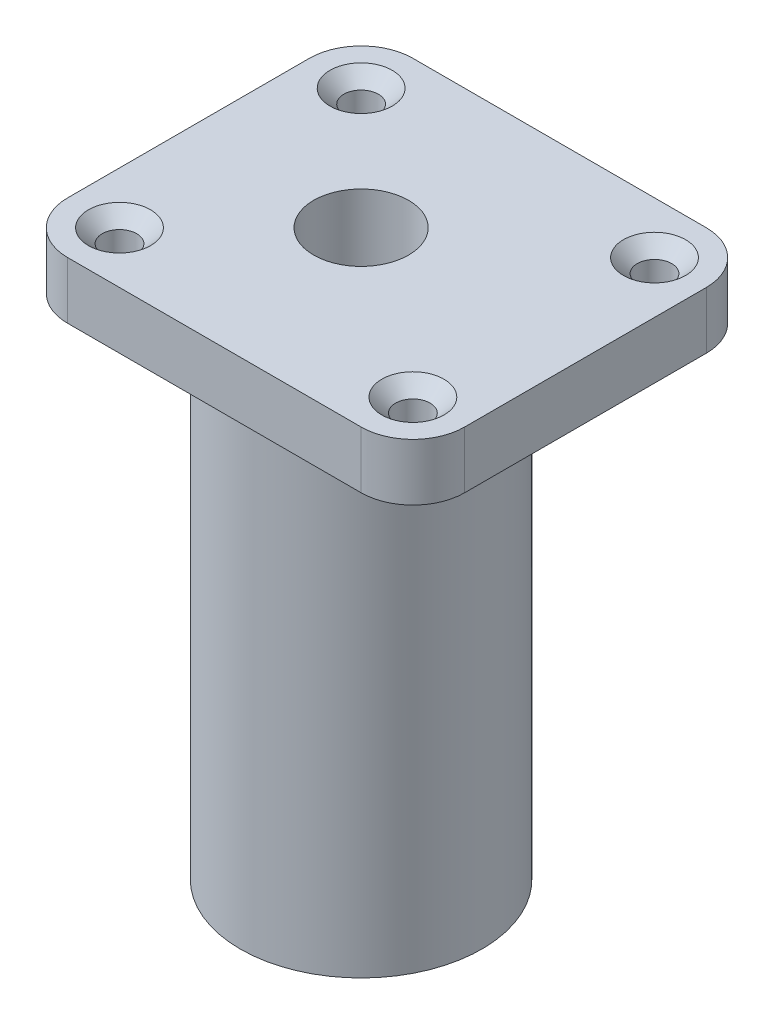
ISO-10303-21;
HEADER;
FILE_DESCRIPTION(('STEP AP214'),'2;1');
FILE_NAME('part.step','',(''),(''),'','','');
FILE_SCHEMA(('AUTOMOTIVE_DESIGN { 1 0 10303 214 1 1 1 1 }'));
ENDSEC;
DATA;
#1=APPLICATION_CONTEXT('core data for automotive mechanical design processes');
#2=APPLICATION_PROTOCOL_DEFINITION('international standard','automotive_design',2000,#1);
#3=PRODUCT_CONTEXT('',#1,'mechanical');
#4=PRODUCT('Part','Part','',(#3));
#5=PRODUCT_RELATED_PRODUCT_CATEGORY('part','',(#4));
#6=PRODUCT_DEFINITION_FORMATION('','',#4);
#7=PRODUCT_DEFINITION_CONTEXT('part definition',#1,'design');
#8=PRODUCT_DEFINITION('design','',#6,#7);
#9=PRODUCT_DEFINITION_SHAPE('','',#8);
#10=(LENGTH_UNIT() NAMED_UNIT(*) SI_UNIT(.MILLI.,.METRE.));
#11=(NAMED_UNIT(*) PLANE_ANGLE_UNIT() SI_UNIT($,.RADIAN.));
#12=(NAMED_UNIT(*) SI_UNIT($,.STERADIAN.) SOLID_ANGLE_UNIT());
#13=UNCERTAINTY_MEASURE_WITH_UNIT(LENGTH_MEASURE(1.E-05),#10,'distance_accuracy_value','');
#14=(GEOMETRIC_REPRESENTATION_CONTEXT(3) GLOBAL_UNCERTAINTY_ASSIGNED_CONTEXT((#13)) GLOBAL_UNIT_ASSIGNED_CONTEXT((#10,
#11,#12)) REPRESENTATION_CONTEXT('',''));
#15=CARTESIAN_POINT('',(0.,0.,0.));
#16=DIRECTION('',(0.,0.,1.));
#17=DIRECTION('',(1.,0.,0.));
#18=AXIS2_PLACEMENT_3D('',#15,#16,#17);
#19=CARTESIAN_POINT('',(0.,32.7,0.));
#20=DIRECTION('',(0.,-1.,0.));
#21=DIRECTION('',(0.,0.,-1.));
#22=AXIS2_PLACEMENT_3D('',#19,#20,#21);
#23=CYLINDRICAL_SURFACE('',#22,7.);
#24=CARTESIAN_POINT('',(0.,28.4,0.));
#25=DIRECTION('',(0.,1.,0.));
#26=DIRECTION('',(0.,0.,1.));
#27=AXIS2_PLACEMENT_3D('',#24,#25,#26);
#28=CIRCLE('',#27,7.);
#29=CARTESIAN_POINT('',(0.,28.4,7.));
#30=VERTEX_POINT('',#29);
#31=EDGE_CURVE('E200',#30,#30,#28,.F.);
#32=ORIENTED_EDGE('',*,*,#31,.T.);
#33=EDGE_LOOP('',(#32));
#34=FACE_BOUND('',#33,.T.);
#35=CARTESIAN_POINT('',(0.,0.,0.));
#36=DIRECTION('',(0.,1.,0.));
#37=DIRECTION('',(0.,0.,1.));
#38=AXIS2_PLACEMENT_3D('',#35,#36,#37);
#39=CIRCLE('',#38,7.);
#40=CARTESIAN_POINT('',(0.,0.,7.));
#41=VERTEX_POINT('',#40);
#42=EDGE_CURVE('E143',#41,#41,#39,.T.);
#43=ORIENTED_EDGE('',*,*,#42,.T.);
#44=EDGE_LOOP('',(#43));
#45=FACE_BOUND('',#44,.T.);
#46=ADVANCED_FACE('F45',(#34,#45),#23,.T.);
#47=CARTESIAN_POINT('',(0.,0.,0.));
#48=DIRECTION('',(0.,1.,0.));
#49=DIRECTION('',(0.,0.,1.));
#50=AXIS2_PLACEMENT_3D('',#47,#48,#49);
#51=PLANE('',#50);
#52=CARTESIAN_POINT('',(0.,0.,0.));
#53=DIRECTION('',(0.,-1.,0.));
#54=DIRECTION('',(0.,0.,-1.));
#55=AXIS2_PLACEMENT_3D('',#52,#53,#54);
#56=CIRCLE('',#55,4.6);
#57=CARTESIAN_POINT('',(0.,0.,-4.6));
#58=VERTEX_POINT('',#57);
#59=EDGE_CURVE('E195',#58,#58,#56,.T.);
#60=ORIENTED_EDGE('',*,*,#59,.F.);
#61=EDGE_LOOP('',(#60));
#62=FACE_BOUND('',#61,.T.);
#63=ORIENTED_EDGE('',*,*,#42,.F.);
#64=EDGE_LOOP('',(#63));
#65=FACE_BOUND('',#64,.T.);
#66=ADVANCED_FACE('F249',(#62,#65),#51,.F.);
#67=CARTESIAN_POINT('',(-10.,29.4,-10.));
#68=DIRECTION('',(-1.,0.,0.));
#69=DIRECTION('',(0.,0.,1.));
#70=AXIS2_PLACEMENT_3D('',#67,#68,#69);
#71=PLANE('',#70);
#72=DIRECTION('',(0.,0.,1.));
#73=VECTOR('',#72,1.);
#74=CARTESIAN_POINT('',(-10.,29.4,-10.));
#75=LINE('',#74,#73);
#76=CARTESIAN_POINT('',(-10.,29.4,-7.));
#77=VERTEX_POINT('',#76);
#78=CARTESIAN_POINT('',(-10.,29.4,7.));
#79=VERTEX_POINT('',#78);
#80=EDGE_CURVE('E316',#77,#79,#75,.T.);
#81=ORIENTED_EDGE('',*,*,#80,.T.);
#82=DIRECTION('',(0.,1.,0.));
#83=VECTOR('',#82,1.);
#84=CARTESIAN_POINT('',(-10.,29.4,7.));
#85=LINE('',#84,#83);
#86=CARTESIAN_POINT('',(-10.,32.7,7.));
#87=VERTEX_POINT('',#86);
#88=EDGE_CURVE('E126',#79,#87,#85,.T.);
#89=ORIENTED_EDGE('',*,*,#88,.T.);
#90=DIRECTION('',(0.,0.,1.));
#91=VECTOR('',#90,1.);
#92=CARTESIAN_POINT('',(-10.,32.7,-10.));
#93=LINE('',#92,#91);
#94=CARTESIAN_POINT('',(-10.,32.7,-7.));
#95=VERTEX_POINT('',#94);
#96=EDGE_CURVE('E117',#95,#87,#93,.T.);
#97=ORIENTED_EDGE('',*,*,#96,.F.);
#98=DIRECTION('',(0.,1.,0.));
#99=VECTOR('',#98,1.);
#100=CARTESIAN_POINT('',(-10.,29.4,-7.));
#101=LINE('',#100,#99);
#102=EDGE_CURVE('E132',#95,#77,#101,.F.);
#103=ORIENTED_EDGE('',*,*,#102,.T.);
#104=EDGE_LOOP('',(#81,#89,#97,#103));
#105=FACE_BOUND('',#104,.T.);
#106=ADVANCED_FACE('F131',(#105),#71,.T.);
#107=CARTESIAN_POINT('',(-10.,29.4,-10.));
#108=DIRECTION('',(0.,0.,-1.));
#109=DIRECTION('',(-1.,0.,0.));
#110=AXIS2_PLACEMENT_3D('',#107,#108,#109);
#111=PLANE('',#110);
#112=DIRECTION('',(-1.,0.,0.));
#113=VECTOR('',#112,1.);
#114=CARTESIAN_POINT('',(-10.,32.7,-10.));
#115=LINE('',#114,#113);
#116=CARTESIAN_POINT('',(10.,32.7,-10.));
#117=VERTEX_POINT('',#116);
#118=CARTESIAN_POINT('',(-7.,32.7,-10.));
#119=VERTEX_POINT('',#118);
#120=EDGE_CURVE('E119',#117,#119,#115,.T.);
#121=ORIENTED_EDGE('',*,*,#120,.F.);
#122=DIRECTION('',(0.,1.,0.));
#123=VECTOR('',#122,1.);
#124=CARTESIAN_POINT('',(10.,29.4,-10.));
#125=LINE('',#124,#123);
#126=CARTESIAN_POINT('',(10.,29.4,-10.));
#127=VERTEX_POINT('',#126);
#128=EDGE_CURVE('E187',#117,#127,#125,.F.);
#129=ORIENTED_EDGE('',*,*,#128,.T.);
#130=DIRECTION('',(-1.,0.,0.));
#131=VECTOR('',#130,1.);
#132=CARTESIAN_POINT('',(-10.,29.4,-10.));
#133=LINE('',#132,#131);
#134=CARTESIAN_POINT('',(-7.,29.4,-10.));
#135=VERTEX_POINT('',#134);
#136=EDGE_CURVE('E149',#127,#135,#133,.T.);
#137=ORIENTED_EDGE('',*,*,#136,.T.);
#138=DIRECTION('',(0.,1.,0.));
#139=VECTOR('',#138,1.);
#140=CARTESIAN_POINT('',(-7.,29.4,-10.));
#141=LINE('',#140,#139);
#142=EDGE_CURVE('E184',#135,#119,#141,.T.);
#143=ORIENTED_EDGE('',*,*,#142,.T.);
#144=EDGE_LOOP('',(#121,#129,#137,#143));
#145=FACE_BOUND('',#144,.T.);
#146=ADVANCED_FACE('F348',(#145),#111,.T.);
#147=CARTESIAN_POINT('',(13.,29.4,-10.));
#148=DIRECTION('',(1.,0.,0.));
#149=DIRECTION('',(0.,0.,-1.));
#150=AXIS2_PLACEMENT_3D('',#147,#148,#149);
#151=PLANE('',#150);
#152=DIRECTION('',(0.,0.,-1.));
#153=VECTOR('',#152,1.);
#154=CARTESIAN_POINT('',(13.,32.7,-10.));
#155=LINE('',#154,#153);
#156=CARTESIAN_POINT('',(13.,32.7,7.));
#157=VERTEX_POINT('',#156);
#158=CARTESIAN_POINT('',(13.,32.7,-7.));
#159=VERTEX_POINT('',#158);
#160=EDGE_CURVE('E332',#157,#159,#155,.T.);
#161=ORIENTED_EDGE('',*,*,#160,.F.);
#162=DIRECTION('',(0.,1.,0.));
#163=VECTOR('',#162,1.);
#164=CARTESIAN_POINT('',(13.,29.4,7.));
#165=LINE('',#164,#163);
#166=CARTESIAN_POINT('',(13.,29.4,7.));
#167=VERTEX_POINT('',#166);
#168=EDGE_CURVE('E69',#157,#167,#165,.F.);
#169=ORIENTED_EDGE('',*,*,#168,.T.);
#170=DIRECTION('',(0.,0.,-1.));
#171=VECTOR('',#170,1.);
#172=CARTESIAN_POINT('',(13.,29.4,-10.));
#173=LINE('',#172,#171);
#174=CARTESIAN_POINT('',(13.,29.4,-7.));
#175=VERTEX_POINT('',#174);
#176=EDGE_CURVE('E323',#167,#175,#173,.T.);
#177=ORIENTED_EDGE('',*,*,#176,.T.);
#178=DIRECTION('',(0.,1.,0.));
#179=VECTOR('',#178,1.);
#180=CARTESIAN_POINT('',(13.,29.4,-7.));
#181=LINE('',#180,#179);
#182=EDGE_CURVE('E178',#175,#159,#181,.T.);
#183=ORIENTED_EDGE('',*,*,#182,.T.);
#184=EDGE_LOOP('',(#161,#169,#177,#183));
#185=FACE_BOUND('',#184,.T.);
#186=ADVANCED_FACE('F336',(#185),#151,.T.);
#187=CARTESIAN_POINT('',(-10.,29.4,10.));
#188=DIRECTION('',(0.,0.,1.));
#189=DIRECTION('',(1.,0.,0.));
#190=AXIS2_PLACEMENT_3D('',#187,#188,#189);
#191=PLANE('',#190);
#192=DIRECTION('',(1.,0.,0.));
#193=VECTOR('',#192,1.);
#194=CARTESIAN_POINT('',(-10.,32.7,10.));
#195=LINE('',#194,#193);
#196=CARTESIAN_POINT('',(-7.,32.7,10.));
#197=VERTEX_POINT('',#196);
#198=CARTESIAN_POINT('',(10.,32.7,10.));
#199=VERTEX_POINT('',#198);
#200=EDGE_CURVE('E136',#197,#199,#195,.T.);
#201=ORIENTED_EDGE('',*,*,#200,.F.);
#202=DIRECTION('',(0.,1.,0.));
#203=VECTOR('',#202,1.);
#204=CARTESIAN_POINT('',(-7.,29.4,10.));
#205=LINE('',#204,#203);
#206=CARTESIAN_POINT('',(-7.,29.4,10.));
#207=VERTEX_POINT('',#206);
#208=EDGE_CURVE('E165',#197,#207,#205,.F.);
#209=ORIENTED_EDGE('',*,*,#208,.T.);
#210=DIRECTION('',(1.,0.,0.));
#211=VECTOR('',#210,1.);
#212=CARTESIAN_POINT('',(-10.,29.4,10.));
#213=LINE('',#212,#211);
#214=CARTESIAN_POINT('',(10.,29.4,10.));
#215=VERTEX_POINT('',#214);
#216=EDGE_CURVE('E319',#207,#215,#213,.T.);
#217=ORIENTED_EDGE('',*,*,#216,.T.);
#218=DIRECTION('',(0.,1.,0.));
#219=VECTOR('',#218,1.);
#220=CARTESIAN_POINT('',(10.,29.4,10.));
#221=LINE('',#220,#219);
#222=EDGE_CURVE('E161',#215,#199,#221,.T.);
#223=ORIENTED_EDGE('',*,*,#222,.T.);
#224=EDGE_LOOP('',(#201,#209,#217,#223));
#225=FACE_BOUND('',#224,.T.);
#226=ADVANCED_FACE('F345',(#225),#191,.T.);
#227=CARTESIAN_POINT('',(0.,29.4,0.));
#228=DIRECTION('',(0.,1.,0.));
#229=DIRECTION('',(0.,0.,1.));
#230=AXIS2_PLACEMENT_3D('',#227,#228,#229);
#231=PLANE('',#230);
#232=CARTESIAN_POINT('',(0.,29.4,0.));
#233=DIRECTION('',(0.,1.,0.));
#234=DIRECTION('',(0.,0.,1.));
#235=AXIS2_PLACEMENT_3D('',#232,#233,#234);
#236=CIRCLE('',#235,8.);
#237=CARTESIAN_POINT('',(0.,29.4,8.));
#238=VERTEX_POINT('',#237);
#239=EDGE_CURVE('E190',#238,#238,#236,.T.);
#240=ORIENTED_EDGE('',*,*,#239,.T.);
#241=EDGE_LOOP('',(#240));
#242=FACE_BOUND('',#241,.T.);
#243=CARTESIAN_POINT('',(-7.,29.4,7.));
#244=DIRECTION('',(0.,1.,0.));
#245=DIRECTION('',(0.,0.,1.));
#246=AXIS2_PLACEMENT_3D('',#243,#244,#245);
#247=CIRCLE('',#246,1.);
#248=CARTESIAN_POINT('',(-7.,29.4,8.));
#249=VERTEX_POINT('',#248);
#250=EDGE_CURVE('E137',#249,#249,#247,.T.);
#251=ORIENTED_EDGE('',*,*,#250,.T.);
#252=EDGE_LOOP('',(#251));
#253=FACE_BOUND('',#252,.T.);
#254=CARTESIAN_POINT('',(10.,29.4,7.));
#255=DIRECTION('',(0.,1.,0.));
#256=DIRECTION('',(0.,0.,1.));
#257=AXIS2_PLACEMENT_3D('',#254,#255,#256);
#258=CIRCLE('',#257,1.);
#259=CARTESIAN_POINT('',(10.,29.4,8.));
#260=VERTEX_POINT('',#259);
#261=EDGE_CURVE('E308',#260,#260,#258,.T.);
#262=ORIENTED_EDGE('',*,*,#261,.T.);
#263=EDGE_LOOP('',(#262));
#264=FACE_BOUND('',#263,.T.);
#265=CARTESIAN_POINT('',(10.,29.4,-7.));
#266=DIRECTION('',(0.,1.,0.));
#267=DIRECTION('',(0.,0.,1.));
#268=AXIS2_PLACEMENT_3D('',#265,#266,#267);
#269=CIRCLE('',#268,1.);
#270=CARTESIAN_POINT('',(10.,29.4,-6.));
#271=VERTEX_POINT('',#270);
#272=EDGE_CURVE('E312',#271,#271,#269,.T.);
#273=ORIENTED_EDGE('',*,*,#272,.T.);
#274=EDGE_LOOP('',(#273));
#275=FACE_BOUND('',#274,.T.);
#276=CARTESIAN_POINT('',(-7.,29.4,-7.));
#277=DIRECTION('',(0.,1.,0.));
#278=DIRECTION('',(0.,0.,1.));
#279=AXIS2_PLACEMENT_3D('',#276,#277,#278);
#280=CIRCLE('',#279,1.);
#281=CARTESIAN_POINT('',(-7.,29.4,-6.));
#282=VERTEX_POINT('',#281);
#283=EDGE_CURVE('E390',#282,#282,#280,.T.);
#284=ORIENTED_EDGE('',*,*,#283,.T.);
#285=EDGE_LOOP('',(#284));
#286=FACE_BOUND('',#285,.T.);
#287=ORIENTED_EDGE('',*,*,#216,.F.);
#288=CARTESIAN_POINT('',(-7.,29.4,7.));
#289=DIRECTION('',(0.,1.,0.));
#290=DIRECTION('',(0.,0.,1.));
#291=AXIS2_PLACEMENT_3D('',#288,#289,#290);
#292=CIRCLE('',#291,3.);
#293=EDGE_CURVE('E175',#207,#79,#292,.F.);
#294=ORIENTED_EDGE('',*,*,#293,.T.);
#295=ORIENTED_EDGE('',*,*,#80,.F.);
#296=CARTESIAN_POINT('',(-7.,29.4,-7.));
#297=DIRECTION('',(0.,1.,0.));
#298=DIRECTION('',(0.,0.,1.));
#299=AXIS2_PLACEMENT_3D('',#296,#297,#298);
#300=CIRCLE('',#299,3.);
#301=EDGE_CURVE('E141',#77,#135,#300,.F.);
#302=ORIENTED_EDGE('',*,*,#301,.T.);
#303=ORIENTED_EDGE('',*,*,#136,.F.);
#304=CARTESIAN_POINT('',(10.,29.4,-7.));
#305=DIRECTION('',(0.,1.,0.));
#306=DIRECTION('',(0.,0.,1.));
#307=AXIS2_PLACEMENT_3D('',#304,#305,#306);
#308=CIRCLE('',#307,3.);
#309=EDGE_CURVE('E62',#127,#175,#308,.F.);
#310=ORIENTED_EDGE('',*,*,#309,.T.);
#311=ORIENTED_EDGE('',*,*,#176,.F.);
#312=CARTESIAN_POINT('',(10.,29.4,7.));
#313=DIRECTION('',(0.,1.,0.));
#314=DIRECTION('',(0.,0.,1.));
#315=AXIS2_PLACEMENT_3D('',#312,#313,#314);
#316=CIRCLE('',#315,3.);
#317=EDGE_CURVE('E172',#167,#215,#316,.F.);
#318=ORIENTED_EDGE('',*,*,#317,.T.);
#319=EDGE_LOOP('',(#287,#294,#295,#302,#303,#310,#311,#318));
#320=FACE_BOUND('',#319,.T.);
#321=ADVANCED_FACE('F341',(#242,#253,#264,#275,#286,#320),#231,.F.);
#322=CARTESIAN_POINT('',(0.,32.7,0.));
#323=DIRECTION('',(0.,1.,0.));
#324=DIRECTION('',(0.,0.,1.));
#325=AXIS2_PLACEMENT_3D('',#322,#323,#324);
#326=PLANE('',#325);
#327=CARTESIAN_POINT('',(-7.,32.7,7.));
#328=DIRECTION('',(0.,1.,0.));
#329=DIRECTION('',(0.,0.,1.));
#330=AXIS2_PLACEMENT_3D('',#327,#328,#329);
#331=CIRCLE('',#330,1.80000000000001);
#332=CARTESIAN_POINT('',(-7.,32.7,8.80000000000001));
#333=VERTEX_POINT('',#332);
#334=EDGE_CURVE('E220',#333,#333,#331,.F.);
#335=ORIENTED_EDGE('',*,*,#334,.T.);
#336=EDGE_LOOP('',(#335));
#337=FACE_BOUND('',#336,.T.);
#338=CARTESIAN_POINT('',(10.,32.7,7.));
#339=DIRECTION('',(0.,1.,0.));
#340=DIRECTION('',(0.,0.,1.));
#341=AXIS2_PLACEMENT_3D('',#338,#339,#340);
#342=CIRCLE('',#341,1.80000000000001);
#343=CARTESIAN_POINT('',(10.,32.7,8.80000000000001));
#344=VERTEX_POINT('',#343);
#345=EDGE_CURVE('E216',#344,#344,#342,.F.);
#346=ORIENTED_EDGE('',*,*,#345,.T.);
#347=EDGE_LOOP('',(#346));
#348=FACE_BOUND('',#347,.T.);
#349=CARTESIAN_POINT('',(10.,32.7,-7.));
#350=DIRECTION('',(0.,1.,0.));
#351=DIRECTION('',(0.,0.,1.));
#352=AXIS2_PLACEMENT_3D('',#349,#350,#351);
#353=CIRCLE('',#352,1.80000000000001);
#354=CARTESIAN_POINT('',(10.,32.7,-5.19999999999999));
#355=VERTEX_POINT('',#354);
#356=EDGE_CURVE('E212',#355,#355,#353,.F.);
#357=ORIENTED_EDGE('',*,*,#356,.T.);
#358=EDGE_LOOP('',(#357));
#359=FACE_BOUND('',#358,.T.);
#360=CARTESIAN_POINT('',(-7.,32.7,-7.));
#361=DIRECTION('',(0.,1.,0.));
#362=DIRECTION('',(0.,0.,1.));
#363=AXIS2_PLACEMENT_3D('',#360,#361,#362);
#364=CIRCLE('',#363,1.80000000000001);
#365=CARTESIAN_POINT('',(-7.,32.7,-5.19999999999999));
#366=VERTEX_POINT('',#365);
#367=EDGE_CURVE('E208',#366,#366,#364,.F.);
#368=ORIENTED_EDGE('',*,*,#367,.T.);
#369=EDGE_LOOP('',(#368));
#370=FACE_BOUND('',#369,.T.);
#371=CARTESIAN_POINT('',(0.,32.7,0.));
#372=DIRECTION('',(0.,1.,0.));
#373=DIRECTION('',(0.,0.,1.));
#374=AXIS2_PLACEMENT_3D('',#371,#372,#373);
#375=CIRCLE('',#374,2.75);
#376=CARTESIAN_POINT('',(0.,32.7,2.75));
#377=VERTEX_POINT('',#376);
#378=EDGE_CURVE('E191',#377,#377,#375,.T.);
#379=ORIENTED_EDGE('',*,*,#378,.F.);
#380=EDGE_LOOP('',(#379));
#381=FACE_BOUND('',#380,.T.);
#382=ORIENTED_EDGE('',*,*,#96,.T.);
#383=CARTESIAN_POINT('',(-7.,32.7,7.));
#384=DIRECTION('',(0.,1.,0.));
#385=DIRECTION('',(0.,0.,1.));
#386=AXIS2_PLACEMENT_3D('',#383,#384,#385);
#387=CIRCLE('',#386,3.);
#388=EDGE_CURVE('E158',#87,#197,#387,.T.);
#389=ORIENTED_EDGE('',*,*,#388,.T.);
#390=ORIENTED_EDGE('',*,*,#200,.T.);
#391=CARTESIAN_POINT('',(10.,32.7,7.));
#392=DIRECTION('',(0.,1.,0.));
#393=DIRECTION('',(0.,0.,1.));
#394=AXIS2_PLACEMENT_3D('',#391,#392,#393);
#395=CIRCLE('',#394,3.);
#396=EDGE_CURVE('E155',#199,#157,#395,.T.);
#397=ORIENTED_EDGE('',*,*,#396,.T.);
#398=ORIENTED_EDGE('',*,*,#160,.T.);
#399=CARTESIAN_POINT('',(10.,32.7,-7.));
#400=DIRECTION('',(0.,1.,0.));
#401=DIRECTION('',(0.,0.,1.));
#402=AXIS2_PLACEMENT_3D('',#399,#400,#401);
#403=CIRCLE('',#402,3.);
#404=EDGE_CURVE('E125',#159,#117,#403,.T.);
#405=ORIENTED_EDGE('',*,*,#404,.T.);
#406=ORIENTED_EDGE('',*,*,#120,.T.);
#407=CARTESIAN_POINT('',(-7.,32.7,-7.));
#408=DIRECTION('',(0.,1.,0.));
#409=DIRECTION('',(0.,0.,1.));
#410=AXIS2_PLACEMENT_3D('',#407,#408,#409);
#411=CIRCLE('',#410,3.);
#412=EDGE_CURVE('E114',#119,#95,#411,.T.);
#413=ORIENTED_EDGE('',*,*,#412,.T.);
#414=EDGE_LOOP('',(#382,#389,#390,#397,#398,#405,#406,#413));
#415=FACE_BOUND('',#414,.T.);
#416=ADVANCED_FACE('F116',(#337,#348,#359,#370,#381,#415),#326,.T.);
#417=CARTESIAN_POINT('',(-7.,29.4,7.));
#418=DIRECTION('',(0.,1.,0.));
#419=DIRECTION('',(0.,0.,1.));
#420=AXIS2_PLACEMENT_3D('',#417,#418,#419);
#421=CYLINDRICAL_SURFACE('',#420,3.);
#422=ORIENTED_EDGE('',*,*,#293,.F.);
#423=ORIENTED_EDGE('',*,*,#208,.F.);
#424=ORIENTED_EDGE('',*,*,#388,.F.);
#425=ORIENTED_EDGE('',*,*,#88,.F.);
#426=EDGE_LOOP('',(#422,#423,#424,#425));
#427=FACE_BOUND('',#426,.T.);
#428=ADVANCED_FACE('F260',(#427),#421,.T.);
#429=CARTESIAN_POINT('',(10.,29.4,7.));
#430=DIRECTION('',(0.,1.,0.));
#431=DIRECTION('',(0.,0.,1.));
#432=AXIS2_PLACEMENT_3D('',#429,#430,#431);
#433=CYLINDRICAL_SURFACE('',#432,3.);
#434=ORIENTED_EDGE('',*,*,#317,.F.);
#435=ORIENTED_EDGE('',*,*,#168,.F.);
#436=ORIENTED_EDGE('',*,*,#396,.F.);
#437=ORIENTED_EDGE('',*,*,#222,.F.);
#438=EDGE_LOOP('',(#434,#435,#436,#437));
#439=FACE_BOUND('',#438,.T.);
#440=ADVANCED_FACE('F263',(#439),#433,.T.);
#441=CARTESIAN_POINT('',(10.,29.4,-7.));
#442=DIRECTION('',(0.,1.,0.));
#443=DIRECTION('',(0.,0.,1.));
#444=AXIS2_PLACEMENT_3D('',#441,#442,#443);
#445=CYLINDRICAL_SURFACE('',#444,3.);
#446=ORIENTED_EDGE('',*,*,#309,.F.);
#447=ORIENTED_EDGE('',*,*,#128,.F.);
#448=ORIENTED_EDGE('',*,*,#404,.F.);
#449=ORIENTED_EDGE('',*,*,#182,.F.);
#450=EDGE_LOOP('',(#446,#447,#448,#449));
#451=FACE_BOUND('',#450,.T.);
#452=ADVANCED_FACE('F267',(#451),#445,.T.);
#453=CARTESIAN_POINT('',(-7.,29.4,-7.));
#454=DIRECTION('',(0.,1.,0.));
#455=DIRECTION('',(0.,0.,1.));
#456=AXIS2_PLACEMENT_3D('',#453,#454,#455);
#457=CYLINDRICAL_SURFACE('',#456,3.);
#458=ORIENTED_EDGE('',*,*,#301,.F.);
#459=ORIENTED_EDGE('',*,*,#102,.F.);
#460=ORIENTED_EDGE('',*,*,#412,.F.);
#461=ORIENTED_EDGE('',*,*,#142,.F.);
#462=EDGE_LOOP('',(#458,#459,#460,#461));
#463=FACE_BOUND('',#462,.T.);
#464=ADVANCED_FACE('F140',(#463),#457,.T.);
#465=CARTESIAN_POINT('',(-7.,27.7,-7.));
#466=DIRECTION('',(0.,1.,0.));
#467=DIRECTION('',(0.,0.,1.));
#468=AXIS2_PLACEMENT_3D('',#465,#466,#467);
#469=CYLINDRICAL_SURFACE('',#468,1.);
#470=CARTESIAN_POINT('',(-7.,31.9,-7.));
#471=DIRECTION('',(0.,1.,0.));
#472=DIRECTION('',(0.,0.,1.));
#473=AXIS2_PLACEMENT_3D('',#470,#471,#472);
#474=CIRCLE('',#473,1.);
#475=CARTESIAN_POINT('',(-7.,31.9,-6.));
#476=VERTEX_POINT('',#475);
#477=EDGE_CURVE('E11',#476,#476,#474,.T.);
#478=ORIENTED_EDGE('',*,*,#477,.T.);
#479=EDGE_LOOP('',(#478));
#480=FACE_BOUND('',#479,.T.);
#481=ORIENTED_EDGE('',*,*,#283,.F.);
#482=EDGE_LOOP('',(#481));
#483=FACE_BOUND('',#482,.T.);
#484=ADVANCED_FACE('F274',(#480,#483),#469,.F.);
#485=CARTESIAN_POINT('',(10.,27.7,-7.));
#486=DIRECTION('',(0.,1.,0.));
#487=DIRECTION('',(0.,0.,1.));
#488=AXIS2_PLACEMENT_3D('',#485,#486,#487);
#489=CYLINDRICAL_SURFACE('',#488,1.);
#490=CARTESIAN_POINT('',(10.,31.9,-7.));
#491=DIRECTION('',(0.,1.,0.));
#492=DIRECTION('',(0.,0.,1.));
#493=AXIS2_PLACEMENT_3D('',#490,#491,#492);
#494=CIRCLE('',#493,1.);
#495=CARTESIAN_POINT('',(10.,31.9,-6.));
#496=VERTEX_POINT('',#495);
#497=EDGE_CURVE('E55',#496,#496,#494,.T.);
#498=ORIENTED_EDGE('',*,*,#497,.T.);
#499=EDGE_LOOP('',(#498));
#500=FACE_BOUND('',#499,.T.);
#501=ORIENTED_EDGE('',*,*,#272,.F.);
#502=EDGE_LOOP('',(#501));
#503=FACE_BOUND('',#502,.T.);
#504=ADVANCED_FACE('F231',(#500,#503),#489,.F.);
#505=CARTESIAN_POINT('',(10.,27.7,7.));
#506=DIRECTION('',(0.,1.,0.));
#507=DIRECTION('',(0.,0.,1.));
#508=AXIS2_PLACEMENT_3D('',#505,#506,#507);
#509=CYLINDRICAL_SURFACE('',#508,1.);
#510=CARTESIAN_POINT('',(10.,31.9,7.));
#511=DIRECTION('',(0.,1.,0.));
#512=DIRECTION('',(0.,0.,1.));
#513=AXIS2_PLACEMENT_3D('',#510,#511,#512);
#514=CIRCLE('',#513,1.);
#515=CARTESIAN_POINT('',(10.,31.9,8.));
#516=VERTEX_POINT('',#515);
#517=EDGE_CURVE('E224',#516,#516,#514,.T.);
#518=ORIENTED_EDGE('',*,*,#517,.T.);
#519=EDGE_LOOP('',(#518));
#520=FACE_BOUND('',#519,.T.);
#521=ORIENTED_EDGE('',*,*,#261,.F.);
#522=EDGE_LOOP('',(#521));
#523=FACE_BOUND('',#522,.T.);
#524=ADVANCED_FACE('F302',(#520,#523),#509,.F.);
#525=CARTESIAN_POINT('',(-7.,27.7,7.));
#526=DIRECTION('',(0.,1.,0.));
#527=DIRECTION('',(0.,0.,1.));
#528=AXIS2_PLACEMENT_3D('',#525,#526,#527);
#529=CYLINDRICAL_SURFACE('',#528,1.);
#530=CARTESIAN_POINT('',(-7.,31.9,7.));
#531=DIRECTION('',(0.,1.,0.));
#532=DIRECTION('',(0.,0.,1.));
#533=AXIS2_PLACEMENT_3D('',#530,#531,#532);
#534=CIRCLE('',#533,1.);
#535=CARTESIAN_POINT('',(-7.,31.9,8.));
#536=VERTEX_POINT('',#535);
#537=EDGE_CURVE('E204',#536,#536,#534,.T.);
#538=ORIENTED_EDGE('',*,*,#537,.T.);
#539=EDGE_LOOP('',(#538));
#540=FACE_BOUND('',#539,.T.);
#541=ORIENTED_EDGE('',*,*,#250,.F.);
#542=EDGE_LOOP('',(#541));
#543=FACE_BOUND('',#542,.T.);
#544=ADVANCED_FACE('F298',(#540,#543),#529,.F.);
#545=CARTESIAN_POINT('',(0.,5.,0.));
#546=DIRECTION('',(0.,-1.,0.));
#547=DIRECTION('',(0.,0.,-1.));
#548=AXIS2_PLACEMENT_3D('',#545,#546,#547);
#549=CYLINDRICAL_SURFACE('',#548,4.6);
#550=CARTESIAN_POINT('',(0.,5.,0.));
#551=DIRECTION('',(0.,-1.,0.));
#552=DIRECTION('',(0.,0.,-1.));
#553=AXIS2_PLACEMENT_3D('',#550,#551,#552);
#554=CIRCLE('',#553,4.6);
#555=CARTESIAN_POINT('',(0.,5.,-4.6));
#556=VERTEX_POINT('',#555);
#557=EDGE_CURVE('E386',#556,#556,#554,.T.);
#558=ORIENTED_EDGE('',*,*,#557,.F.);
#559=EDGE_LOOP('',(#558));
#560=FACE_BOUND('',#559,.T.);
#561=ORIENTED_EDGE('',*,*,#59,.T.);
#562=EDGE_LOOP('',(#561));
#563=FACE_BOUND('',#562,.T.);
#564=ADVANCED_FACE('F301',(#560,#563),#549,.F.);
#565=CARTESIAN_POINT('',(0.,5.,0.));
#566=DIRECTION('',(0.,-1.,0.));
#567=DIRECTION('',(0.,0.,-1.));
#568=AXIS2_PLACEMENT_3D('',#565,#566,#567);
#569=PLANE('',#568);
#570=CARTESIAN_POINT('',(0.,5.,0.));
#571=DIRECTION('',(0.,-1.,0.));
#572=DIRECTION('',(0.,0.,-1.));
#573=AXIS2_PLACEMENT_3D('',#570,#571,#572);
#574=CIRCLE('',#573,2.75);
#575=CARTESIAN_POINT('',(0.,5.,-2.75));
#576=VERTEX_POINT('',#575);
#577=EDGE_CURVE('E196',#576,#576,#574,.T.);
#578=ORIENTED_EDGE('',*,*,#577,.F.);
#579=EDGE_LOOP('',(#578));
#580=FACE_BOUND('',#579,.T.);
#581=ORIENTED_EDGE('',*,*,#557,.T.);
#582=EDGE_LOOP('',(#581));
#583=FACE_BOUND('',#582,.T.);
#584=ADVANCED_FACE('F378',(#580,#583),#569,.T.);
#585=CARTESIAN_POINT('',(0.,41.,0.));
#586=DIRECTION('',(0.,-1.,0.));
#587=DIRECTION('',(0.,0.,-1.));
#588=AXIS2_PLACEMENT_3D('',#585,#586,#587);
#589=CYLINDRICAL_SURFACE('',#588,2.75);
#590=ORIENTED_EDGE('',*,*,#378,.T.);
#591=EDGE_LOOP('',(#590));
#592=FACE_BOUND('',#591,.T.);
#593=ORIENTED_EDGE('',*,*,#577,.T.);
#594=EDGE_LOOP('',(#593));
#595=FACE_BOUND('',#594,.T.);
#596=ADVANCED_FACE('F278',(#592,#595),#589,.F.);
#597=CARTESIAN_POINT('',(0.,28.4,0.));
#598=DIRECTION('',(0.,1.,0.));
#599=DIRECTION('',(0.,0.,1.));
#600=AXIS2_PLACEMENT_3D('',#597,#598,#599);
#601=TOROIDAL_SURFACE('',#600,8.,1.);
#602=ORIENTED_EDGE('',*,*,#31,.F.);
#603=EDGE_LOOP('',(#602));
#604=FACE_BOUND('',#603,.T.);
#605=ORIENTED_EDGE('',*,*,#239,.F.);
#606=EDGE_LOOP('',(#605));
#607=FACE_BOUND('',#606,.T.);
#608=ADVANCED_FACE('F275',(#604,#607),#601,.F.);
#609=CARTESIAN_POINT('',(-7.,31.9,7.));
#610=DIRECTION('',(0.,1.,0.));
#611=DIRECTION('',(0.,0.,1.));
#612=AXIS2_PLACEMENT_3D('',#609,#610,#611);
#613=CONICAL_SURFACE('',#612,1.,0.785398163397445);
#614=ORIENTED_EDGE('',*,*,#334,.F.);
#615=EDGE_LOOP('',(#614));
#616=FACE_BOUND('',#615,.T.);
#617=ORIENTED_EDGE('',*,*,#537,.F.);
#618=EDGE_LOOP('',(#617));
#619=FACE_BOUND('',#618,.T.);
#620=ADVANCED_FACE('F243',(#616,#619),#613,.F.);
#621=CARTESIAN_POINT('',(10.,31.9,7.));
#622=DIRECTION('',(0.,1.,0.));
#623=DIRECTION('',(0.,0.,1.));
#624=AXIS2_PLACEMENT_3D('',#621,#622,#623);
#625=CONICAL_SURFACE('',#624,1.,0.785398163397445);
#626=ORIENTED_EDGE('',*,*,#345,.F.);
#627=EDGE_LOOP('',(#626));
#628=FACE_BOUND('',#627,.T.);
#629=ORIENTED_EDGE('',*,*,#517,.F.);
#630=EDGE_LOOP('',(#629));
#631=FACE_BOUND('',#630,.T.);
#632=ADVANCED_FACE('F236',(#628,#631),#625,.F.);
#633=CARTESIAN_POINT('',(10.,31.9,-7.));
#634=DIRECTION('',(0.,1.,0.));
#635=DIRECTION('',(0.,0.,1.));
#636=AXIS2_PLACEMENT_3D('',#633,#634,#635);
#637=CONICAL_SURFACE('',#636,1.,0.785398163397449);
#638=ORIENTED_EDGE('',*,*,#356,.F.);
#639=EDGE_LOOP('',(#638));
#640=FACE_BOUND('',#639,.T.);
#641=ORIENTED_EDGE('',*,*,#497,.F.);
#642=EDGE_LOOP('',(#641));
#643=FACE_BOUND('',#642,.T.);
#644=ADVANCED_FACE('F234',(#640,#643),#637,.F.);
#645=CARTESIAN_POINT('',(-7.,31.9,-7.));
#646=DIRECTION('',(0.,1.,0.));
#647=DIRECTION('',(0.,0.,1.));
#648=AXIS2_PLACEMENT_3D('',#645,#646,#647);
#649=CONICAL_SURFACE('',#648,1.,0.785398163397445);
#650=ORIENTED_EDGE('',*,*,#367,.F.);
#651=EDGE_LOOP('',(#650));
#652=FACE_BOUND('',#651,.T.);
#653=ORIENTED_EDGE('',*,*,#477,.F.);
#654=EDGE_LOOP('',(#653));
#655=FACE_BOUND('',#654,.T.);
#656=ADVANCED_FACE('F48',(#652,#655),#649,.F.);
#657=CLOSED_SHELL('',(#46,#66,#106,#146,#186,#226,#321,#416,#428,#440,#452,#464,#484,#504,#524,
#544,#564,#584,#596,#608,#620,#632,#644,#656));
#658=MANIFOLD_SOLID_BREP('B2',#657);
#659=ADVANCED_BREP_SHAPE_REPRESENTATION('',(#18,#658),#14);
#660=SHAPE_DEFINITION_REPRESENTATION(#9,#659);
ENDSEC;
END-ISO-10303-21;
